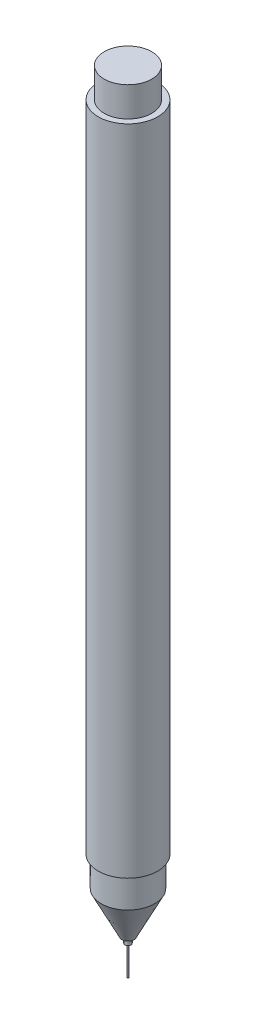
ISO-10303-21;
HEADER;
FILE_DESCRIPTION(('STEP AP214'),'2;1');
FILE_NAME('part.step','',(''),(''),'','','');
FILE_SCHEMA(('AUTOMOTIVE_DESIGN { 1 0 10303 214 1 1 1 1 }'));
ENDSEC;
DATA;
#1=APPLICATION_CONTEXT('core data for automotive mechanical design processes');
#2=APPLICATION_PROTOCOL_DEFINITION('international standard','automotive_design',2000,#1);
#3=PRODUCT_CONTEXT('',#1,'mechanical');
#4=PRODUCT('Part','Part','',(#3));
#5=PRODUCT_RELATED_PRODUCT_CATEGORY('part','',(#4));
#6=PRODUCT_DEFINITION_FORMATION('','',#4);
#7=PRODUCT_DEFINITION_CONTEXT('part definition',#1,'design');
#8=PRODUCT_DEFINITION('design','',#6,#7);
#9=PRODUCT_DEFINITION_SHAPE('','',#8);
#10=(LENGTH_UNIT() NAMED_UNIT(*) SI_UNIT(.MILLI.,.METRE.));
#11=(NAMED_UNIT(*) PLANE_ANGLE_UNIT() SI_UNIT($,.RADIAN.));
#12=(NAMED_UNIT(*) SI_UNIT($,.STERADIAN.) SOLID_ANGLE_UNIT());
#13=UNCERTAINTY_MEASURE_WITH_UNIT(LENGTH_MEASURE(1.E-05),#10,'distance_accuracy_value','');
#14=(GEOMETRIC_REPRESENTATION_CONTEXT(3) GLOBAL_UNCERTAINTY_ASSIGNED_CONTEXT((#13)) GLOBAL_UNIT_ASSIGNED_CONTEXT((#10,
#11,#12)) REPRESENTATION_CONTEXT('',''));
#15=CARTESIAN_POINT('',(0.,0.,0.));
#16=DIRECTION('',(0.,0.,1.));
#17=DIRECTION('',(1.,0.,0.));
#18=AXIS2_PLACEMENT_3D('',#15,#16,#17);
#19=CARTESIAN_POINT('',(3.99999999999996,70.,0.));
#20=DIRECTION('',(0.,-1.,0.));
#21=DIRECTION('',(1.,0.,0.));
#22=AXIS2_PLACEMENT_3D('',#19,#20,#21);
#23=PLANE('',#22);
#24=CARTESIAN_POINT('',(0.,70.,0.));
#25=DIRECTION('',(0.,1.,0.));
#26=DIRECTION('',(-1.,0.,0.));
#27=AXIS2_PLACEMENT_3D('',#24,#25,#26);
#28=CIRCLE('',#27,4.);
#29=CARTESIAN_POINT('',(-4.00000000000003,70.,0.));
#30=VERTEX_POINT('',#29);
#31=EDGE_CURVE('E76',#30,#30,#28,.T.);
#32=ORIENTED_EDGE('',*,*,#31,.F.);
#33=EDGE_LOOP('',(#32));
#34=FACE_BOUND('',#33,.T.);
#35=CARTESIAN_POINT('',(0.,70.,0.));
#36=DIRECTION('',(0.,1.,0.));
#37=DIRECTION('',(-1.,0.,0.));
#38=AXIS2_PLACEMENT_3D('',#35,#36,#37);
#39=CIRCLE('',#38,5.);
#40=CARTESIAN_POINT('',(-5.00000000000003,70.,0.));
#41=VERTEX_POINT('',#40);
#42=EDGE_CURVE('E10',#41,#41,#39,.T.);
#43=ORIENTED_EDGE('',*,*,#42,.T.);
#44=EDGE_LOOP('',(#43));
#45=FACE_BOUND('',#44,.T.);
#46=ADVANCED_FACE('F39',(#34,#45),#23,.F.);
#47=CARTESIAN_POINT('',(0.,75.,0.));
#48=DIRECTION('',(0.,1.,0.));
#49=DIRECTION('',(-1.,0.,0.));
#50=AXIS2_PLACEMENT_3D('',#47,#48,#49);
#51=CYLINDRICAL_SURFACE('',#50,4.99999999999998);
#52=ORIENTED_EDGE('',*,*,#42,.F.);
#53=EDGE_LOOP('',(#52));
#54=FACE_BOUND('',#53,.T.);
#55=CARTESIAN_POINT('',(0.,-40.,0.));
#56=DIRECTION('',(0.,1.,0.));
#57=DIRECTION('',(-1.,0.,0.));
#58=AXIS2_PLACEMENT_3D('',#55,#56,#57);
#59=CIRCLE('',#58,4.99999999999996);
#60=CARTESIAN_POINT('',(-4.99999999999996,-40.,0.));
#61=VERTEX_POINT('',#60);
#62=EDGE_CURVE('E45',#61,#61,#59,.T.);
#63=ORIENTED_EDGE('',*,*,#62,.T.);
#64=EDGE_LOOP('',(#63));
#65=FACE_BOUND('',#64,.T.);
#66=ADVANCED_FACE('F83',(#54,#65),#51,.T.);
#67=CARTESIAN_POINT('',(4.99999999999996,-40.,0.));
#68=DIRECTION('',(0.,1.,0.));
#69=DIRECTION('',(-1.,0.,0.));
#70=AXIS2_PLACEMENT_3D('',#67,#68,#69);
#71=PLANE('',#70);
#72=ORIENTED_EDGE('',*,*,#62,.F.);
#73=EDGE_LOOP('',(#72));
#74=FACE_BOUND('',#73,.T.);
#75=CARTESIAN_POINT('',(0.,-40.,0.));
#76=DIRECTION('',(0.,1.,0.));
#77=DIRECTION('',(-1.,0.,0.));
#78=AXIS2_PLACEMENT_3D('',#75,#76,#77);
#79=CIRCLE('',#78,4.49999999999996);
#80=CARTESIAN_POINT('',(-4.49999999999997,-40.,0.));
#81=VERTEX_POINT('',#80);
#82=EDGE_CURVE('E49',#81,#81,#79,.T.);
#83=ORIENTED_EDGE('',*,*,#82,.T.);
#84=EDGE_LOOP('',(#83));
#85=FACE_BOUND('',#84,.T.);
#86=ADVANCED_FACE('F87',(#74,#85),#71,.F.);
#87=CARTESIAN_POINT('',(0.,75.,0.));
#88=DIRECTION('',(0.,1.,0.));
#89=DIRECTION('',(-1.,0.,0.));
#90=AXIS2_PLACEMENT_3D('',#87,#88,#89);
#91=CYLINDRICAL_SURFACE('',#90,4.49999999999996);
#92=ORIENTED_EDGE('',*,*,#82,.F.);
#93=EDGE_LOOP('',(#92));
#94=FACE_BOUND('',#93,.T.);
#95=CARTESIAN_POINT('',(0.,-45.,0.));
#96=DIRECTION('',(0.,1.,0.));
#97=DIRECTION('',(-1.,0.,0.));
#98=AXIS2_PLACEMENT_3D('',#95,#96,#97);
#99=CIRCLE('',#98,4.49999999999996);
#100=CARTESIAN_POINT('',(-4.49999999999996,-45.,0.));
#101=VERTEX_POINT('',#100);
#102=EDGE_CURVE('E53',#101,#101,#99,.T.);
#103=ORIENTED_EDGE('',*,*,#102,.T.);
#104=EDGE_LOOP('',(#103));
#105=FACE_BOUND('',#104,.T.);
#106=ADVANCED_FACE('F92',(#94,#105),#91,.T.);
#107=CARTESIAN_POINT('',(0.,-52.,0.));
#108=DIRECTION('',(0.,1.,0.));
#109=DIRECTION('',(-1.,0.,0.));
#110=AXIS2_PLACEMENT_3D('',#107,#108,#109);
#111=CONICAL_SURFACE('',#110,1.00898127072072,0.462620651371587);
#112=CARTESIAN_POINT('',(0.,-52.,0.));
#113=DIRECTION('',(0.,1.,0.));
#114=DIRECTION('',(-1.,0.,0.));
#115=AXIS2_PLACEMENT_3D('',#112,#113,#114);
#116=CIRCLE('',#115,1.00898127072072);
#117=CARTESIAN_POINT('',(-1.00898127072072,-52.,0.));
#118=VERTEX_POINT('',#117);
#119=EDGE_CURVE('E58',#118,#118,#116,.T.);
#120=CARTESIAN_POINT('',(-4.49999999999996,-45.,0.));
#121=CARTESIAN_POINT('',(-4.46363522156997,-45.0729166666667,0.));
#122=CARTESIAN_POINT('',(-4.42727044313998,-45.1458333333333,0.));
#123=CARTESIAN_POINT('',(-4.35454088627999,-45.2916666666667,0.));
#124=CARTESIAN_POINT('',(-4.31817610785,-45.3645833333333,0.));
#125=CARTESIAN_POINT('',(-4.24544655099001,-45.5104166666667,0.));
#126=CARTESIAN_POINT('',(-4.20908177256002,-45.5833333333333,0.));
#127=CARTESIAN_POINT('',(-4.13635221570004,-45.7291666666667,0.));
#128=CARTESIAN_POINT('',(-4.09998743727005,-45.8020833333333,0.));
#129=CARTESIAN_POINT('',(-4.02725788041006,-45.9479166666667,0.));
#130=CARTESIAN_POINT('',(-3.99089310198007,-46.0208333333333,0.));
#131=CARTESIAN_POINT('',(-3.91816354512009,-46.1666666666667,0.));
#132=CARTESIAN_POINT('',(-3.8817987666901,-46.2395833333333,0.));
#133=CARTESIAN_POINT('',(-3.80906920983011,-46.3854166666667,0.));
#134=CARTESIAN_POINT('',(-3.77270443140012,-46.4583333333333,0.));
#135=CARTESIAN_POINT('',(-3.69997487454013,-46.6041666666667,0.));
#136=CARTESIAN_POINT('',(-3.66361009611014,-46.6770833333333,0.));
#137=CARTESIAN_POINT('',(-3.59088053925016,-46.8229166666667,0.));
#138=CARTESIAN_POINT('',(-3.55451576082017,-46.8958333333333,0.));
#139=CARTESIAN_POINT('',(-3.48178620396018,-47.0416666666667,0.));
#140=CARTESIAN_POINT('',(-3.44542142553019,-47.1145833333333,0.));
#141=CARTESIAN_POINT('',(-3.37269186867021,-47.2604166666667,0.));
#142=CARTESIAN_POINT('',(-3.33632709024021,-47.3333333333333,0.));
#143=CARTESIAN_POINT('',(-3.26359753338023,-47.4791666666667,0.));
#144=CARTESIAN_POINT('',(-3.22723275495024,-47.5520833333333,0.));
#145=CARTESIAN_POINT('',(-3.15450319809025,-47.6979166666667,0.));
#146=CARTESIAN_POINT('',(-3.11813841966026,-47.7708333333333,0.));
#147=CARTESIAN_POINT('',(-3.04540886280028,-47.9166666666667,0.));
#148=CARTESIAN_POINT('',(-3.00904408437028,-47.9895833333333,0.));
#149=CARTESIAN_POINT('',(-2.9363145275103,-48.1354166666667,0.));
#150=CARTESIAN_POINT('',(-2.89994974908031,-48.2083333333333,0.));
#151=CARTESIAN_POINT('',(-2.82722019222032,-48.3541666666667,0.));
#152=CARTESIAN_POINT('',(-2.79085541379033,-48.4270833333333,0.));
#153=CARTESIAN_POINT('',(-2.71812585693035,-48.5729166666667,0.));
#154=CARTESIAN_POINT('',(-2.68176107850035,-48.6458333333333,0.));
#155=CARTESIAN_POINT('',(-2.60903152164037,-48.7916666666667,0.));
#156=CARTESIAN_POINT('',(-2.57266674321038,-48.8645833333333,0.));
#157=CARTESIAN_POINT('',(-2.4999371863504,-49.0104166666667,0.));
#158=CARTESIAN_POINT('',(-2.4635724079204,-49.0833333333333,0.));
#159=CARTESIAN_POINT('',(-2.39084285106042,-49.2291666666667,0.));
#160=CARTESIAN_POINT('',(-2.35447807263043,-49.3020833333333,0.));
#161=CARTESIAN_POINT('',(-2.28174851577044,-49.4479166666667,0.));
#162=CARTESIAN_POINT('',(-2.24538373734045,-49.5208333333333,0.));
#163=CARTESIAN_POINT('',(-2.17265418048047,-49.6666666666667,0.));
#164=CARTESIAN_POINT('',(-2.13628940205047,-49.7395833333333,0.));
#165=CARTESIAN_POINT('',(-2.06355984519049,-49.8854166666667,0.));
#166=CARTESIAN_POINT('',(-2.0271950667605,-49.9583333333333,0.));
#167=CARTESIAN_POINT('',(-1.95446550990051,-50.1041666666667,0.));
#168=CARTESIAN_POINT('',(-1.91810073147052,-50.1770833333333,0.));
#169=CARTESIAN_POINT('',(-1.84537117461054,-50.3229166666667,0.));
#170=CARTESIAN_POINT('',(-1.80900639618054,-50.3958333333333,0.));
#171=CARTESIAN_POINT('',(-1.73627683932056,-50.5416666666667,0.));
#172=CARTESIAN_POINT('',(-1.69991206089057,-50.6145833333333,0.));
#173=CARTESIAN_POINT('',(-1.62718250403058,-50.7604166666667,0.));
#174=CARTESIAN_POINT('',(-1.59081772560059,-50.8333333333333,0.));
#175=CARTESIAN_POINT('',(-1.51808816874061,-50.9791666666667,0.));
#176=CARTESIAN_POINT('',(-1.48172339031062,-51.0520833333333,0.));
#177=CARTESIAN_POINT('',(-1.40899383345063,-51.1979166666667,0.));
#178=CARTESIAN_POINT('',(-1.37262905502064,-51.2708333333333,0.));
#179=CARTESIAN_POINT('',(-1.29989949816066,-51.4166666666667,0.));
#180=CARTESIAN_POINT('',(-1.26353471973066,-51.4895833333333,0.));
#181=CARTESIAN_POINT('',(-1.19080516287068,-51.6354166666667,0.));
#182=CARTESIAN_POINT('',(-1.15444038444069,-51.7083333333333,0.));
#183=CARTESIAN_POINT('',(-1.0817108275807,-51.8541666666667,0.));
#184=CARTESIAN_POINT('',(-1.04534604915071,-51.9270833333333,0.));
#185=CARTESIAN_POINT('',(-1.00898127072072,-52.,0.));
#186=B_SPLINE_CURVE_WITH_KNOTS('',3,(#120,#121,#122,#123,#124,#125,#126,#127,#128,#129,#130,
#131,#132,#133,#134,#135,#136,#137,#138,#139,#140,#141,#142,#143,#144,#145,#146,#147,#148,#149,
#150,#151,#152,#153,#154,#155,#156,#157,#158,#159,#160,#161,#162,#163,#164,#165,#166,#167,#168,
#169,#170,#171,#172,#173,#174,#175,#176,#177,#178,#179,#180,#181,#182,#183,#184,#185),
.UNSPECIFIED.,.F.,.F.,(4,2,2,2,2,2,2,2,2,2,2,2,2,2,2,2,2,2,2,2,2,2,2,2,2,2,2,2,2,2,2,2,4),(0.,
0.244444546865671,0.488889093731343,0.733333640597008,0.977778187462673,1.22222273432834,
1.46666728119401,1.71111182805968,1.95555637492534,2.20000092179102,2.44444546865669,
2.68889001552235,2.93333456238802,3.17777910925369,3.42222365611936,3.66666820298503,
3.91111274985069,4.15555729671636,4.40000184358203,4.6444463904477,4.88889093731336,
5.13333548417904,5.37778003104471,5.62222457791037,5.86666912477604,6.11111367164171,
6.35555821850738,6.60000276537304,6.84444731223871,7.08889185910438,7.33333640597005,
7.57778095283572,7.82222549970138),.UNSPECIFIED.);
#187=EDGE_CURVE('BSEAM98',#101,#118,#186,.T.);
#188=ORIENTED_EDGE('',*,*,#102,.F.);
#189=ORIENTED_EDGE('',*,*,#119,.T.);
#190=ORIENTED_EDGE('',*,*,#187,.T.);
#191=ORIENTED_EDGE('',*,*,#187,.F.);
#192=EDGE_LOOP('',(#188,#190,#189,#191));
#193=FACE_BOUND('',#192,.T.);
#194=ADVANCED_FACE('F98',(#193),#111,.T.);
#195=CARTESIAN_POINT('',(1.00898127072073,-52.,0.));
#196=DIRECTION('',(0.,1.,0.));
#197=DIRECTION('',(-1.,0.,0.));
#198=AXIS2_PLACEMENT_3D('',#195,#196,#197);
#199=PLANE('',#198);
#200=ORIENTED_EDGE('',*,*,#119,.F.);
#201=EDGE_LOOP('',(#200));
#202=FACE_BOUND('',#201,.T.);
#203=CARTESIAN_POINT('',(0.,-52.,0.));
#204=DIRECTION('',(0.,1.,0.));
#205=DIRECTION('',(-1.,0.,0.));
#206=AXIS2_PLACEMENT_3D('',#203,#204,#205);
#207=CIRCLE('',#206,0.508981270720723);
#208=CARTESIAN_POINT('',(-0.50898127072072,-52.,0.));
#209=VERTEX_POINT('',#208);
#210=EDGE_CURVE('E61',#209,#209,#207,.T.);
#211=ORIENTED_EDGE('',*,*,#210,.T.);
#212=EDGE_LOOP('',(#211));
#213=FACE_BOUND('',#212,.T.);
#214=ADVANCED_FACE('F102',(#202,#213),#199,.F.);
#215=CARTESIAN_POINT('',(0.,75.,0.));
#216=DIRECTION('',(0.,1.,0.));
#217=DIRECTION('',(-1.,0.,0.));
#218=AXIS2_PLACEMENT_3D('',#215,#216,#217);
#219=CYLINDRICAL_SURFACE('',#218,0.508981270720723);
#220=ORIENTED_EDGE('',*,*,#210,.F.);
#221=EDGE_LOOP('',(#220));
#222=FACE_BOUND('',#221,.T.);
#223=CARTESIAN_POINT('',(0.,-53.,0.));
#224=DIRECTION('',(0.,1.,0.));
#225=DIRECTION('',(-1.,0.,0.));
#226=AXIS2_PLACEMENT_3D('',#223,#224,#225);
#227=CIRCLE('',#226,0.508981270720723);
#228=CARTESIAN_POINT('',(-0.508981270720719,-53.,0.));
#229=VERTEX_POINT('',#228);
#230=EDGE_CURVE('E64',#229,#229,#227,.T.);
#231=ORIENTED_EDGE('',*,*,#230,.T.);
#232=EDGE_LOOP('',(#231));
#233=FACE_BOUND('',#232,.T.);
#234=ADVANCED_FACE('F106',(#222,#233),#219,.T.);
#235=CARTESIAN_POINT('',(0.508981270720726,-53.,0.));
#236=DIRECTION('',(0.,1.,0.));
#237=DIRECTION('',(-1.,0.,0.));
#238=AXIS2_PLACEMENT_3D('',#235,#236,#237);
#239=PLANE('',#238);
#240=ORIENTED_EDGE('',*,*,#230,.F.);
#241=EDGE_LOOP('',(#240));
#242=FACE_BOUND('',#241,.T.);
#243=CARTESIAN_POINT('',(0.,-53.,0.));
#244=DIRECTION('',(0.,1.,0.));
#245=DIRECTION('',(-1.,0.,0.));
#246=AXIS2_PLACEMENT_3D('',#243,#244,#245);
#247=CIRCLE('',#246,0.108981270720723);
#248=CARTESIAN_POINT('',(-0.108981270720719,-53.,0.));
#249=VERTEX_POINT('',#248);
#250=EDGE_CURVE('E67',#249,#249,#247,.T.);
#251=ORIENTED_EDGE('',*,*,#250,.T.);
#252=EDGE_LOOP('',(#251));
#253=FACE_BOUND('',#252,.T.);
#254=ADVANCED_FACE('F110',(#242,#253),#239,.F.);
#255=CARTESIAN_POINT('',(0.,75.,0.));
#256=DIRECTION('',(0.,1.,0.));
#257=DIRECTION('',(-1.,0.,0.));
#258=AXIS2_PLACEMENT_3D('',#255,#256,#257);
#259=CYLINDRICAL_SURFACE('',#258,0.108981270720722);
#260=ORIENTED_EDGE('',*,*,#250,.F.);
#261=EDGE_LOOP('',(#260));
#262=FACE_BOUND('',#261,.T.);
#263=CARTESIAN_POINT('',(0.,-58.,0.));
#264=DIRECTION('',(0.,1.,0.));
#265=DIRECTION('',(-1.,0.,0.));
#266=AXIS2_PLACEMENT_3D('',#263,#264,#265);
#267=CIRCLE('',#266,0.108981270720722);
#268=CARTESIAN_POINT('',(-0.108981270720717,-58.,0.));
#269=VERTEX_POINT('',#268);
#270=EDGE_CURVE('E70',#269,#269,#267,.T.);
#271=ORIENTED_EDGE('',*,*,#270,.T.);
#272=EDGE_LOOP('',(#271));
#273=FACE_BOUND('',#272,.T.);
#274=ADVANCED_FACE('F114',(#262,#273),#259,.T.);
#275=CARTESIAN_POINT('',(0.108981270720727,-58.,0.));
#276=DIRECTION('',(0.,1.,0.));
#277=DIRECTION('',(-1.,0.,0.));
#278=AXIS2_PLACEMENT_3D('',#275,#276,#277);
#279=PLANE('',#278);
#280=ORIENTED_EDGE('',*,*,#270,.F.);
#281=EDGE_LOOP('',(#280));
#282=FACE_BOUND('',#281,.T.);
#283=ADVANCED_FACE('F118',(#282),#279,.F.);
#284=CARTESIAN_POINT('',(0.,75.,0.));
#285=DIRECTION('',(0.,-1.,0.));
#286=DIRECTION('',(1.,0.,0.));
#287=AXIS2_PLACEMENT_3D('',#284,#285,#286);
#288=PLANE('',#287);
#289=CARTESIAN_POINT('',(0.,75.,0.));
#290=DIRECTION('',(0.,1.,0.));
#291=DIRECTION('',(-1.,0.,0.));
#292=AXIS2_PLACEMENT_3D('',#289,#290,#291);
#293=CIRCLE('',#292,4.);
#294=CARTESIAN_POINT('',(-4.00000000000003,75.,0.));
#295=VERTEX_POINT('',#294);
#296=EDGE_CURVE('E73',#295,#295,#293,.T.);
#297=ORIENTED_EDGE('',*,*,#296,.T.);
#298=EDGE_LOOP('',(#297));
#299=FACE_BOUND('',#298,.T.);
#300=ADVANCED_FACE('F122',(#299),#288,.F.);
#301=CARTESIAN_POINT('',(0.,75.,0.));
#302=DIRECTION('',(0.,1.,0.));
#303=DIRECTION('',(-1.,0.,0.));
#304=AXIS2_PLACEMENT_3D('',#301,#302,#303);
#305=CYLINDRICAL_SURFACE('',#304,4.);
#306=ORIENTED_EDGE('',*,*,#296,.F.);
#307=EDGE_LOOP('',(#306));
#308=FACE_BOUND('',#307,.T.);
#309=ORIENTED_EDGE('',*,*,#31,.T.);
#310=EDGE_LOOP('',(#309));
#311=FACE_BOUND('',#310,.T.);
#312=ADVANCED_FACE('F80',(#308,#311),#305,.T.);
#313=CLOSED_SHELL('',(#46,#66,#86,#106,#194,#214,#234,#254,#274,#283,#300,#312));
#314=MANIFOLD_SOLID_BREP('B2',#313);
#315=ADVANCED_BREP_SHAPE_REPRESENTATION('',(#18,#314),#14);
#316=SHAPE_DEFINITION_REPRESENTATION(#9,#315);
ENDSEC;
END-ISO-10303-21;
